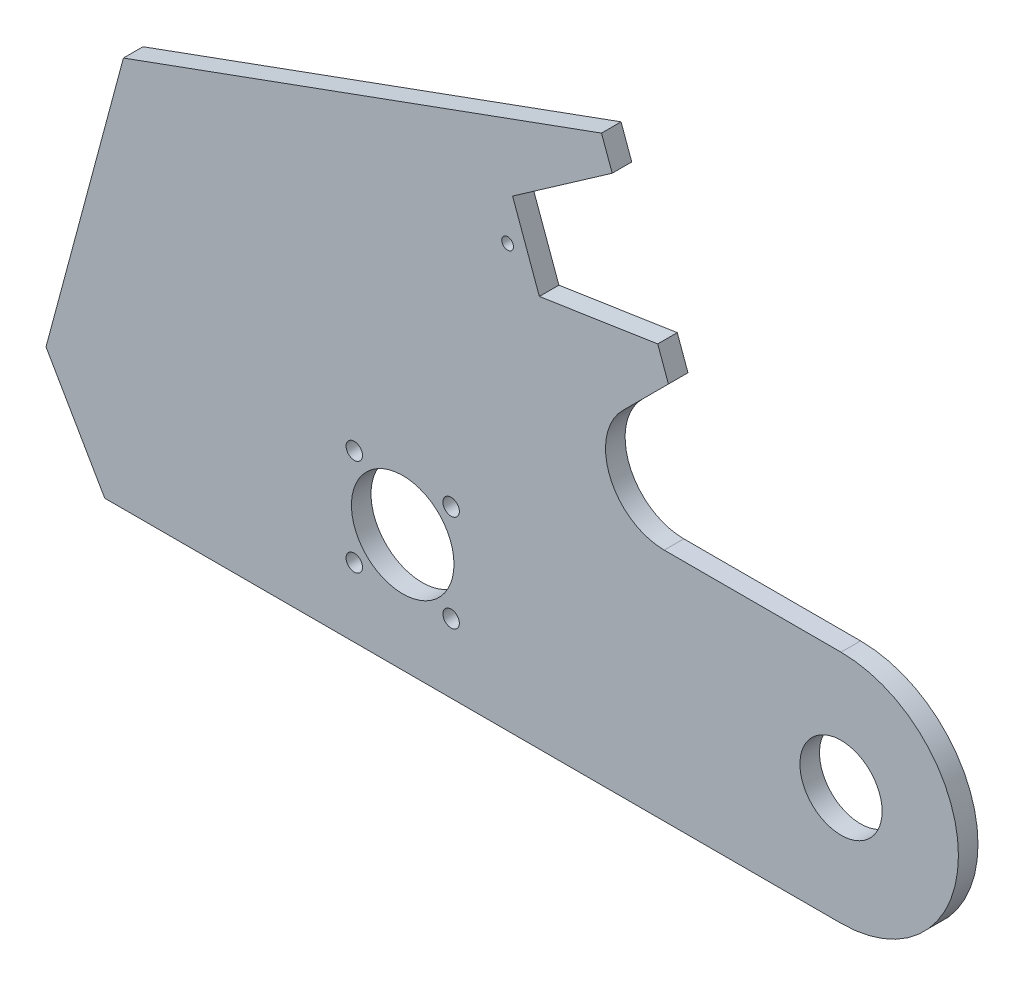
ISO-10303-21;
HEADER;
FILE_DESCRIPTION(('STEP AP214'),'2;1');
FILE_NAME('part.step','',(''),(''),'','','');
FILE_SCHEMA(('AUTOMOTIVE_DESIGN { 1 0 10303 214 1 1 1 1 }'));
ENDSEC;
DATA;
#1=APPLICATION_CONTEXT('core data for automotive mechanical design processes');
#2=APPLICATION_PROTOCOL_DEFINITION('international standard','automotive_design',2000,#1);
#3=PRODUCT_CONTEXT('',#1,'mechanical');
#4=PRODUCT('Part','Part','',(#3));
#5=PRODUCT_RELATED_PRODUCT_CATEGORY('part','',(#4));
#6=PRODUCT_DEFINITION_FORMATION('','',#4);
#7=PRODUCT_DEFINITION_CONTEXT('part definition',#1,'design');
#8=PRODUCT_DEFINITION('design','',#6,#7);
#9=PRODUCT_DEFINITION_SHAPE('','',#8);
#10=(LENGTH_UNIT() NAMED_UNIT(*) SI_UNIT(.MILLI.,.METRE.));
#11=(NAMED_UNIT(*) PLANE_ANGLE_UNIT() SI_UNIT($,.RADIAN.));
#12=(NAMED_UNIT(*) SI_UNIT($,.STERADIAN.) SOLID_ANGLE_UNIT());
#13=UNCERTAINTY_MEASURE_WITH_UNIT(LENGTH_MEASURE(1.E-05),#10,'distance_accuracy_value','');
#14=(GEOMETRIC_REPRESENTATION_CONTEXT(3) GLOBAL_UNCERTAINTY_ASSIGNED_CONTEXT((#13)) GLOBAL_UNIT_ASSIGNED_CONTEXT((#10,
#11,#12)) REPRESENTATION_CONTEXT('',''));
#15=CARTESIAN_POINT('',(0.,0.,0.));
#16=DIRECTION('',(0.,0.,1.));
#17=DIRECTION('',(1.,0.,0.));
#18=AXIS2_PLACEMENT_3D('',#15,#16,#17);
#19=CARTESIAN_POINT('',(74.89234488638,161.13121478231,-6.43945454671325));
#20=DIRECTION('',(-0.93969262078591,-0.342020143325664,0.));
#21=DIRECTION('',(0.342020143325664,-0.93969262078591,0.));
#22=AXIS2_PLACEMENT_3D('',#19,#20,#21);
#23=PLANE('',#22);
#24=DIRECTION('',(-0.342020143325664,0.93969262078591,0.));
#25=VECTOR('',#24,1.);
#26=CARTESIAN_POINT('',(74.89234488638,161.13121478231,-11.4394545467132));
#27=LINE('',#26,#25);
#28=CARTESIAN_POINT('',(91.9933520526632,114.146583743014,-11.4394545467132));
#29=VERTEX_POINT('',#28);
#30=CARTESIAN_POINT('',(89.2571909060579,121.664124709302,-11.4394545467132));
#31=VERTEX_POINT('',#30);
#32=EDGE_CURVE('E202',#29,#31,#27,.T.);
#33=ORIENTED_EDGE('',*,*,#32,.T.);
#34=DIRECTION('',(0.,0.,1.));
#35=VECTOR('',#34,1.);
#36=CARTESIAN_POINT('',(89.2571909060579,121.664124709302,-11.4394545467132));
#37=LINE('',#36,#35);
#38=CARTESIAN_POINT('',(89.2571909060579,121.664124709302,-6.43945454671325));
#39=VERTEX_POINT('',#38);
#40=EDGE_CURVE('E163',#31,#39,#37,.T.);
#41=ORIENTED_EDGE('',*,*,#40,.T.);
#42=DIRECTION('',(-0.342020143325664,0.93969262078591,0.));
#43=VECTOR('',#42,1.);
#44=CARTESIAN_POINT('',(74.89234488638,161.13121478231,-6.43945454671325));
#45=LINE('',#44,#43);
#46=CARTESIAN_POINT('',(91.9933520526632,114.146583743014,-6.43945454671325));
#47=VERTEX_POINT('',#46);
#48=EDGE_CURVE('E184',#47,#39,#45,.T.);
#49=ORIENTED_EDGE('',*,*,#48,.F.);
#50=DIRECTION('',(0.,0.,-1.));
#51=VECTOR('',#50,1.);
#52=CARTESIAN_POINT('',(91.9933520526632,114.146583743014,-6.43945454671325));
#53=LINE('',#52,#51);
#54=EDGE_CURVE('E226',#47,#29,#53,.T.);
#55=ORIENTED_EDGE('',*,*,#54,.T.);
#56=EDGE_LOOP('',(#33,#41,#49,#55));
#57=FACE_BOUND('',#56,.T.);
#58=ADVANCED_FACE('F34',(#57),#23,.F.);
#59=CARTESIAN_POINT('',(136.098229907914,46.8676693314216,-6.43945454671325));
#60=DIRECTION('',(0.,0.,1.));
#61=DIRECTION('',(1.,0.,0.));
#62=AXIS2_PLACEMENT_3D('',#59,#60,#61);
#63=PLANE('',#62);
#64=CARTESIAN_POINT('',(11.7238612371492,34.493300660657,-6.43945454671325));
#65=DIRECTION('',(0.,0.,1.));
#66=DIRECTION('',(1.,0.,0.));
#67=AXIS2_PLACEMENT_3D('',#64,#65,#66);
#68=CIRCLE('',#67,2.1);
#69=CARTESIAN_POINT('',(13.8238612371492,34.493300660657,-6.43945454671325));
#70=VERTEX_POINT('',#69);
#71=EDGE_CURVE('E443',#70,#70,#68,.T.);
#72=ORIENTED_EDGE('',*,*,#71,.F.);
#73=EDGE_LOOP('',(#72));
#74=FACE_BOUND('',#73,.T.);
#75=CARTESIAN_POINT('',(36.4725985786784,34.493300660657,-6.43945454671325));
#76=DIRECTION('',(0.,0.,1.));
#77=DIRECTION('',(1.,0.,0.));
#78=AXIS2_PLACEMENT_3D('',#75,#76,#77);
#79=CIRCLE('',#78,2.1);
#80=CARTESIAN_POINT('',(38.5725985786784,34.493300660657,-6.43945454671325));
#81=VERTEX_POINT('',#80);
#82=EDGE_CURVE('E445',#81,#81,#79,.T.);
#83=ORIENTED_EDGE('',*,*,#82,.F.);
#84=EDGE_LOOP('',(#83));
#85=FACE_BOUND('',#84,.T.);
#86=CARTESIAN_POINT('',(36.4725985786784,59.2420380021862,-6.43945454671325));
#87=DIRECTION('',(0.,0.,1.));
#88=DIRECTION('',(1.,0.,0.));
#89=AXIS2_PLACEMENT_3D('',#86,#87,#88);
#90=CIRCLE('',#89,2.1);
#91=CARTESIAN_POINT('',(38.5725985786784,59.2420380021862,-6.43945454671325));
#92=VERTEX_POINT('',#91);
#93=EDGE_CURVE('E475',#92,#92,#90,.T.);
#94=ORIENTED_EDGE('',*,*,#93,.F.);
#95=EDGE_LOOP('',(#94));
#96=FACE_BOUND('',#95,.T.);
#97=CARTESIAN_POINT('',(11.7238612371492,59.2420380021862,-6.43945454671325));
#98=DIRECTION('',(0.,0.,1.));
#99=DIRECTION('',(1.,0.,0.));
#100=AXIS2_PLACEMENT_3D('',#97,#98,#99);
#101=CIRCLE('',#100,2.1);
#102=CARTESIAN_POINT('',(13.8238612371492,59.2420380021862,-6.43945454671325));
#103=VERTEX_POINT('',#102);
#104=EDGE_CURVE('E465',#103,#103,#101,.T.);
#105=ORIENTED_EDGE('',*,*,#104,.F.);
#106=EDGE_LOOP('',(#105));
#107=FACE_BOUND('',#106,.T.);
#108=CARTESIAN_POINT('',(24.0982299079138,46.8676693314216,-6.43945454671325));
#109=DIRECTION('',(0.,0.,1.));
#110=DIRECTION('',(1.,0.,0.));
#111=AXIS2_PLACEMENT_3D('',#108,#109,#110);
#112=CIRCLE('',#111,13.1);
#113=CARTESIAN_POINT('',(37.1982299079138,46.8676693314216,-6.43945454671325));
#114=VERTEX_POINT('',#113);
#115=EDGE_CURVE('E452',#114,#114,#112,.T.);
#116=ORIENTED_EDGE('',*,*,#115,.F.);
#117=EDGE_LOOP('',(#116));
#118=FACE_BOUND('',#117,.T.);
#119=CARTESIAN_POINT('',(50.8956268853404,124.728501625478,-6.43945454671325));
#120=DIRECTION('',(0.,0.,1.));
#121=DIRECTION('',(1.,0.,0.));
#122=AXIS2_PLACEMENT_3D('',#119,#120,#121);
#123=CIRCLE('',#122,1.5);
#124=CARTESIAN_POINT('',(52.3956268853404,124.728501625478,-6.43945454671325));
#125=VERTEX_POINT('',#124);
#126=EDGE_CURVE('E156',#125,#125,#123,.T.);
#127=ORIENTED_EDGE('',*,*,#126,.F.);
#128=EDGE_LOOP('',(#127));
#129=FACE_BOUND('',#128,.T.);
#130=DIRECTION('',(0.988520093680456,0.151089458235781,0.));
#131=VECTOR('',#130,1.);
#132=CARTESIAN_POINT('',(59.0142914225266,117.041676134247,-6.43945454671325));
#133=LINE('',#132,#131);
#134=CARTESIAN_POINT('',(59.0142914225266,117.041676134247,-6.43945454671325));
#135=VERTEX_POINT('',#134);
#136=EDGE_CURVE('E151',#135,#39,#133,.T.);
#137=ORIENTED_EDGE('',*,*,#136,.F.);
#138=DIRECTION('',(0.342020143325664,-0.93969262078591,0.));
#139=VECTOR('',#138,1.);
#140=CARTESIAN_POINT('',(52.1738885560133,135.835528549965,-6.43945454671325));
#141=LINE('',#140,#139);
#142=CARTESIAN_POINT('',(52.1738885560133,135.835528549965,-6.43945454671325));
#143=VERTEX_POINT('',#142);
#144=EDGE_CURVE('E153',#143,#135,#141,.T.);
#145=ORIENTED_EDGE('',*,*,#144,.F.);
#146=DIRECTION('',(-0.819838026014496,-0.572595503912365,0.));
#147=VECTOR('',#146,1.);
#148=CARTESIAN_POINT('',(77.6285060329854,153.613673816023,-6.43945454671325));
#149=LINE('',#148,#147);
#150=CARTESIAN_POINT('',(77.6285060329854,153.613673816023,-6.43945454671325));
#151=VERTEX_POINT('',#150);
#152=EDGE_CURVE('E131',#151,#143,#149,.T.);
#153=ORIENTED_EDGE('',*,*,#152,.F.);
#154=CARTESIAN_POINT('',(74.89234488638,161.13121478231,-6.43945454671325));
#155=VERTEX_POINT('',#154);
#156=EDGE_CURVE('E183',#151,#155,#45,.T.);
#157=ORIENTED_EDGE('',*,*,#156,.T.);
#158=DIRECTION('',(-0.93969262078591,-0.342020143325664,0.));
#159=VECTOR('',#158,1.);
#160=CARTESIAN_POINT('',(-47.2676958157883,116.668596149974,-6.43945454671325));
#161=LINE('',#160,#159);
#162=CARTESIAN_POINT('',(-47.2676958157883,116.668596149974,-6.43945454671325));
#163=VERTEX_POINT('',#162);
#164=EDGE_CURVE('E187',#155,#163,#161,.T.);
#165=ORIENTED_EDGE('',*,*,#164,.T.);
#166=DIRECTION('',(-0.258819045102524,-0.965925826289067,0.));
#167=VECTOR('',#166,1.);
#168=CARTESIAN_POINT('',(-67.0477493336309,42.8484314449548,-6.43945454671325));
#169=LINE('',#168,#167);
#170=CARTESIAN_POINT('',(-67.0477493336309,42.8484314449548,-6.43945454671325));
#171=VERTEX_POINT('',#170);
#172=EDGE_CURVE('E189',#163,#171,#169,.T.);
#173=ORIENTED_EDGE('',*,*,#172,.T.);
#174=DIRECTION('',(0.499999999999998,-0.86602540378444,0.));
#175=VECTOR('',#174,1.);
#176=CARTESIAN_POINT('',(-52.0477493336309,16.8676693314216,-6.43945454671325));
#177=LINE('',#176,#175);
#178=CARTESIAN_POINT('',(-52.0477493336309,16.8676693314216,-6.43945454671325));
#179=VERTEX_POINT('',#178);
#180=EDGE_CURVE('E191',#171,#179,#177,.T.);
#181=ORIENTED_EDGE('',*,*,#180,.T.);
#182=DIRECTION('',(1.,0.,0.));
#183=VECTOR('',#182,1.);
#184=CARTESIAN_POINT('',(136.098229907914,16.8676693314216,-6.43945454671325));
#185=LINE('',#184,#183);
#186=CARTESIAN_POINT('',(136.098229907914,16.8676693314216,-6.43945454671325));
#187=VERTEX_POINT('',#186);
#188=EDGE_CURVE('E193',#179,#187,#185,.T.);
#189=ORIENTED_EDGE('',*,*,#188,.T.);
#190=CARTESIAN_POINT('',(136.098229907914,46.8676693314216,-6.43945454671325));
#191=DIRECTION('',(0.,0.,1.));
#192=DIRECTION('',(1.,0.,0.));
#193=AXIS2_PLACEMENT_3D('',#190,#191,#192);
#194=CIRCLE('',#193,30.);
#195=CARTESIAN_POINT('',(136.098229907914,76.8676693314216,-6.43945454671325));
#196=VERTEX_POINT('',#195);
#197=EDGE_CURVE('E175',#187,#196,#194,.T.);
#198=ORIENTED_EDGE('',*,*,#197,.T.);
#199=DIRECTION('',(-1.,0.,0.));
#200=VECTOR('',#199,1.);
#201=CARTESIAN_POINT('',(136.098229907914,76.8676693314216,-6.43945454671325));
#202=LINE('',#201,#200);
#203=CARTESIAN_POINT('',(90.9276410766668,76.8676693314216,-6.43945454671325));
#204=VERTEX_POINT('',#203);
#205=EDGE_CURVE('E178',#196,#204,#202,.T.);
#206=ORIENTED_EDGE('',*,*,#205,.T.);
#207=CARTESIAN_POINT('',(90.9276410766668,91.8676693314216,-6.43945454671325));
#208=DIRECTION('',(0.,0.,1.));
#209=DIRECTION('',(1.,0.,0.));
#210=AXIS2_PLACEMENT_3D('',#207,#208,#209);
#211=CIRCLE('',#210,15.);
#212=CARTESIAN_POINT('',(80.3210393588686,102.47427104922,-6.43945454671325));
#213=VERTEX_POINT('',#212);
#214=EDGE_CURVE('E11',#204,#213,#211,.F.);
#215=ORIENTED_EDGE('',*,*,#214,.T.);
#216=DIRECTION('',(0.707106781186546,0.707106781186549,0.));
#217=VECTOR('',#216,1.);
#218=CARTESIAN_POINT('',(91.9933520526632,114.146583743014,-6.43945454671325));
#219=LINE('',#218,#217);
#220=EDGE_CURVE('E181',#213,#47,#219,.T.);
#221=ORIENTED_EDGE('',*,*,#220,.T.);
#222=ORIENTED_EDGE('',*,*,#48,.T.);
#223=EDGE_LOOP('',(#137,#145,#153,#157,#165,#173,#181,#189,#198,#206,#215,#221,#222));
#224=FACE_BOUND('',#223,.T.);
#225=CARTESIAN_POINT('',(136.098229907914,46.8676693314216,-6.43945454671325));
#226=DIRECTION('',(0.,0.,1.));
#227=DIRECTION('',(1.,0.,0.));
#228=AXIS2_PLACEMENT_3D('',#225,#226,#227);
#229=CIRCLE('',#228,10.5);
#230=CARTESIAN_POINT('',(146.598229907914,46.8676693314216,-6.43945454671325));
#231=VERTEX_POINT('',#230);
#232=EDGE_CURVE('E169',#231,#231,#229,.T.);
#233=ORIENTED_EDGE('',*,*,#232,.F.);
#234=EDGE_LOOP('',(#233));
#235=FACE_BOUND('',#234,.T.);
#236=ADVANCED_FACE('F246',(#74,#85,#96,#107,#118,#129,#224,#235),#63,.T.);
#237=CARTESIAN_POINT('',(136.098229907914,46.8676693314216,-11.4394545467132));
#238=DIRECTION('',(0.,0.,1.));
#239=DIRECTION('',(1.,0.,0.));
#240=AXIS2_PLACEMENT_3D('',#237,#238,#239);
#241=PLANE('',#240);
#242=CARTESIAN_POINT('',(11.7238612371492,34.493300660657,-11.4394545467132));
#243=DIRECTION('',(0.,0.,1.));
#244=DIRECTION('',(1.,0.,0.));
#245=AXIS2_PLACEMENT_3D('',#242,#243,#244);
#246=CIRCLE('',#245,2.1);
#247=CARTESIAN_POINT('',(13.8238612371492,34.493300660657,-11.4394545467132));
#248=VERTEX_POINT('',#247);
#249=EDGE_CURVE('E440',#248,#248,#246,.T.);
#250=ORIENTED_EDGE('',*,*,#249,.T.);
#251=EDGE_LOOP('',(#250));
#252=FACE_BOUND('',#251,.T.);
#253=CARTESIAN_POINT('',(36.4725985786784,34.493300660657,-11.4394545467132));
#254=DIRECTION('',(0.,0.,1.));
#255=DIRECTION('',(1.,0.,0.));
#256=AXIS2_PLACEMENT_3D('',#253,#254,#255);
#257=CIRCLE('',#256,2.1);
#258=CARTESIAN_POINT('',(38.5725985786784,34.493300660657,-11.4394545467132));
#259=VERTEX_POINT('',#258);
#260=EDGE_CURVE('E478',#259,#259,#257,.T.);
#261=ORIENTED_EDGE('',*,*,#260,.T.);
#262=EDGE_LOOP('',(#261));
#263=FACE_BOUND('',#262,.T.);
#264=CARTESIAN_POINT('',(36.4725985786784,59.2420380021862,-11.4394545467132));
#265=DIRECTION('',(0.,0.,1.));
#266=DIRECTION('',(1.,0.,0.));
#267=AXIS2_PLACEMENT_3D('',#264,#265,#266);
#268=CIRCLE('',#267,2.1);
#269=CARTESIAN_POINT('',(38.5725985786784,59.2420380021862,-11.4394545467132));
#270=VERTEX_POINT('',#269);
#271=EDGE_CURVE('E470',#270,#270,#268,.T.);
#272=ORIENTED_EDGE('',*,*,#271,.T.);
#273=EDGE_LOOP('',(#272));
#274=FACE_BOUND('',#273,.T.);
#275=CARTESIAN_POINT('',(11.7238612371492,59.2420380021862,-11.4394545467132));
#276=DIRECTION('',(0.,0.,1.));
#277=DIRECTION('',(1.,0.,0.));
#278=AXIS2_PLACEMENT_3D('',#275,#276,#277);
#279=CIRCLE('',#278,2.1);
#280=CARTESIAN_POINT('',(13.8238612371492,59.2420380021862,-11.4394545467132));
#281=VERTEX_POINT('',#280);
#282=EDGE_CURVE('E454',#281,#281,#279,.T.);
#283=ORIENTED_EDGE('',*,*,#282,.T.);
#284=EDGE_LOOP('',(#283));
#285=FACE_BOUND('',#284,.T.);
#286=CARTESIAN_POINT('',(24.0982299079138,46.8676693314216,-11.4394545467132));
#287=DIRECTION('',(0.,0.,1.));
#288=DIRECTION('',(1.,0.,0.));
#289=AXIS2_PLACEMENT_3D('',#286,#287,#288);
#290=CIRCLE('',#289,13.1);
#291=CARTESIAN_POINT('',(37.1982299079138,46.8676693314216,-11.4394545467132));
#292=VERTEX_POINT('',#291);
#293=EDGE_CURVE('E449',#292,#292,#290,.T.);
#294=ORIENTED_EDGE('',*,*,#293,.T.);
#295=EDGE_LOOP('',(#294));
#296=FACE_BOUND('',#295,.T.);
#297=CARTESIAN_POINT('',(50.8956268853404,124.728501625478,-11.4394545467132));
#298=DIRECTION('',(0.,0.,1.));
#299=DIRECTION('',(1.,0.,0.));
#300=AXIS2_PLACEMENT_3D('',#297,#298,#299);
#301=CIRCLE('',#300,1.5);
#302=CARTESIAN_POINT('',(52.3956268853404,124.728501625478,-11.4394545467132));
#303=VERTEX_POINT('',#302);
#304=EDGE_CURVE('E161',#303,#303,#301,.T.);
#305=ORIENTED_EDGE('',*,*,#304,.T.);
#306=EDGE_LOOP('',(#305));
#307=FACE_BOUND('',#306,.T.);
#308=DIRECTION('',(0.342020143325664,-0.93969262078591,0.));
#309=VECTOR('',#308,1.);
#310=CARTESIAN_POINT('',(52.1738885560133,135.835528549965,-11.4394545467132));
#311=LINE('',#310,#309);
#312=CARTESIAN_POINT('',(52.1738885560133,135.835528549965,-11.4394545467132));
#313=VERTEX_POINT('',#312);
#314=CARTESIAN_POINT('',(59.0142914225266,117.041676134247,-11.4394545467132));
#315=VERTEX_POINT('',#314);
#316=EDGE_CURVE('E139',#313,#315,#311,.T.);
#317=ORIENTED_EDGE('',*,*,#316,.T.);
#318=DIRECTION('',(0.988520093680456,0.151089458235781,0.));
#319=VECTOR('',#318,1.);
#320=CARTESIAN_POINT('',(59.0142914225266,117.041676134247,-11.4394545467132));
#321=LINE('',#320,#319);
#322=EDGE_CURVE('E144',#315,#31,#321,.T.);
#323=ORIENTED_EDGE('',*,*,#322,.T.);
#324=ORIENTED_EDGE('',*,*,#32,.F.);
#325=DIRECTION('',(0.707106781186546,0.707106781186549,0.));
#326=VECTOR('',#325,1.);
#327=CARTESIAN_POINT('',(91.9933520526632,114.146583743014,-11.4394545467132));
#328=LINE('',#327,#326);
#329=CARTESIAN_POINT('',(80.3210393588686,102.47427104922,-11.4394545467132));
#330=VERTEX_POINT('',#329);
#331=EDGE_CURVE('E200',#330,#29,#328,.T.);
#332=ORIENTED_EDGE('',*,*,#331,.F.);
#333=CARTESIAN_POINT('',(90.9276410766668,91.8676693314216,-11.4394545467132));
#334=DIRECTION('',(0.,0.,1.));
#335=DIRECTION('',(1.,0.,0.));
#336=AXIS2_PLACEMENT_3D('',#333,#334,#335);
#337=CIRCLE('',#336,15.);
#338=CARTESIAN_POINT('',(90.9276410766668,76.8676693314216,-11.4394545467132));
#339=VERTEX_POINT('',#338);
#340=EDGE_CURVE('E42',#330,#339,#337,.T.);
#341=ORIENTED_EDGE('',*,*,#340,.T.);
#342=DIRECTION('',(-1.,0.,0.));
#343=VECTOR('',#342,1.);
#344=CARTESIAN_POINT('',(136.098229907914,76.8676693314216,-11.4394545467132));
#345=LINE('',#344,#343);
#346=CARTESIAN_POINT('',(136.098229907914,76.8676693314216,-11.4394545467132));
#347=VERTEX_POINT('',#346);
#348=EDGE_CURVE('E198',#347,#339,#345,.T.);
#349=ORIENTED_EDGE('',*,*,#348,.F.);
#350=CARTESIAN_POINT('',(136.098229907914,46.8676693314216,-11.4394545467132));
#351=DIRECTION('',(0.,0.,1.));
#352=DIRECTION('',(1.,0.,0.));
#353=AXIS2_PLACEMENT_3D('',#350,#351,#352);
#354=CIRCLE('',#353,30.);
#355=CARTESIAN_POINT('',(136.098229907914,16.8676693314216,-11.4394545467132));
#356=VERTEX_POINT('',#355);
#357=EDGE_CURVE('E172',#356,#347,#354,.T.);
#358=ORIENTED_EDGE('',*,*,#357,.F.);
#359=DIRECTION('',(1.,0.,0.));
#360=VECTOR('',#359,1.);
#361=CARTESIAN_POINT('',(136.098229907914,16.8676693314216,-11.4394545467132));
#362=LINE('',#361,#360);
#363=CARTESIAN_POINT('',(-52.0477493336309,16.8676693314216,-11.4394545467132));
#364=VERTEX_POINT('',#363);
#365=EDGE_CURVE('E179',#364,#356,#362,.T.);
#366=ORIENTED_EDGE('',*,*,#365,.F.);
#367=DIRECTION('',(0.499999999999998,-0.86602540378444,0.));
#368=VECTOR('',#367,1.);
#369=CARTESIAN_POINT('',(-52.0477493336309,16.8676693314216,-11.4394545467132));
#370=LINE('',#369,#368);
#371=CARTESIAN_POINT('',(-67.0477493336309,42.8484314449548,-11.4394545467132));
#372=VERTEX_POINT('',#371);
#373=EDGE_CURVE('E209',#372,#364,#370,.T.);
#374=ORIENTED_EDGE('',*,*,#373,.F.);
#375=DIRECTION('',(-0.258819045102524,-0.965925826289067,0.));
#376=VECTOR('',#375,1.);
#377=CARTESIAN_POINT('',(-67.0477493336309,42.8484314449548,-11.4394545467132));
#378=LINE('',#377,#376);
#379=CARTESIAN_POINT('',(-47.2676958157883,116.668596149974,-11.4394545467132));
#380=VERTEX_POINT('',#379);
#381=EDGE_CURVE('E207',#380,#372,#378,.T.);
#382=ORIENTED_EDGE('',*,*,#381,.F.);
#383=DIRECTION('',(-0.93969262078591,-0.342020143325664,0.));
#384=VECTOR('',#383,1.);
#385=CARTESIAN_POINT('',(-47.2676958157883,116.668596149974,-11.4394545467132));
#386=LINE('',#385,#384);
#387=CARTESIAN_POINT('',(74.89234488638,161.13121478231,-11.4394545467132));
#388=VERTEX_POINT('',#387);
#389=EDGE_CURVE('E205',#388,#380,#386,.T.);
#390=ORIENTED_EDGE('',*,*,#389,.F.);
#391=CARTESIAN_POINT('',(77.6285060329854,153.613673816023,-11.4394545467132));
#392=VERTEX_POINT('',#391);
#393=EDGE_CURVE('E150',#392,#388,#27,.T.);
#394=ORIENTED_EDGE('',*,*,#393,.F.);
#395=DIRECTION('',(-0.819838026014496,-0.572595503912365,0.));
#396=VECTOR('',#395,1.);
#397=CARTESIAN_POINT('',(77.6285060329854,153.613673816023,-11.4394545467132));
#398=LINE('',#397,#396);
#399=EDGE_CURVE('E49',#392,#313,#398,.T.);
#400=ORIENTED_EDGE('',*,*,#399,.T.);
#401=EDGE_LOOP('',(#317,#323,#324,#332,#341,#349,#358,#366,#374,#382,#390,#394,#400));
#402=FACE_BOUND('',#401,.T.);
#403=CARTESIAN_POINT('',(136.098229907914,46.8676693314216,-11.4394545467132));
#404=DIRECTION('',(0.,0.,1.));
#405=DIRECTION('',(1.,0.,0.));
#406=AXIS2_PLACEMENT_3D('',#403,#404,#405);
#407=CIRCLE('',#406,10.5);
#408=CARTESIAN_POINT('',(146.598229907914,46.8676693314216,-11.4394545467132));
#409=VERTEX_POINT('',#408);
#410=EDGE_CURVE('E166',#409,#409,#407,.T.);
#411=ORIENTED_EDGE('',*,*,#410,.T.);
#412=EDGE_LOOP('',(#411));
#413=FACE_BOUND('',#412,.T.);
#414=ADVANCED_FACE('F147',(#252,#263,#274,#285,#296,#307,#402,#413),#241,.F.);
#415=CARTESIAN_POINT('',(136.098229907914,46.8676693314216,-6.43945454671325));
#416=DIRECTION('',(0.,0.,-1.));
#417=DIRECTION('',(-1.,0.,0.));
#418=AXIS2_PLACEMENT_3D('',#415,#416,#417);
#419=CYLINDRICAL_SURFACE('',#418,30.);
#420=ORIENTED_EDGE('',*,*,#357,.T.);
#421=DIRECTION('',(0.,0.,-1.));
#422=VECTOR('',#421,1.);
#423=CARTESIAN_POINT('',(136.098229907914,76.8676693314216,-6.43945454671325));
#424=LINE('',#423,#422);
#425=EDGE_CURVE('E229',#196,#347,#424,.T.);
#426=ORIENTED_EDGE('',*,*,#425,.F.);
#427=ORIENTED_EDGE('',*,*,#197,.F.);
#428=DIRECTION('',(0.,0.,-1.));
#429=VECTOR('',#428,1.);
#430=CARTESIAN_POINT('',(136.098229907914,16.8676693314216,-6.43945454671325));
#431=LINE('',#430,#429);
#432=EDGE_CURVE('E195',#187,#356,#431,.T.);
#433=ORIENTED_EDGE('',*,*,#432,.T.);
#434=EDGE_LOOP('',(#420,#426,#427,#433));
#435=FACE_BOUND('',#434,.T.);
#436=ADVANCED_FACE('F303',(#435),#419,.T.);
#437=CARTESIAN_POINT('',(136.098229907914,76.8676693314216,-6.43945454671325));
#438=DIRECTION('',(0.,-1.,0.));
#439=DIRECTION('',(1.,0.,0.));
#440=AXIS2_PLACEMENT_3D('',#437,#438,#439);
#441=PLANE('',#440);
#442=ORIENTED_EDGE('',*,*,#348,.T.);
#443=DIRECTION('',(0.,0.,-1.));
#444=VECTOR('',#443,1.);
#445=CARTESIAN_POINT('',(90.9276410766668,76.8676693314216,-6.43945454671325));
#446=LINE('',#445,#444);
#447=EDGE_CURVE('E57',#339,#204,#446,.F.);
#448=ORIENTED_EDGE('',*,*,#447,.T.);
#449=ORIENTED_EDGE('',*,*,#205,.F.);
#450=ORIENTED_EDGE('',*,*,#425,.T.);
#451=EDGE_LOOP('',(#442,#448,#449,#450));
#452=FACE_BOUND('',#451,.T.);
#453=ADVANCED_FACE('F240',(#452),#441,.F.);
#454=CARTESIAN_POINT('',(91.9933520526632,114.146583743014,-6.43945454671325));
#455=DIRECTION('',(-0.707106781186549,0.707106781186546,0.));
#456=DIRECTION('',(-0.707106781186546,-0.707106781186549,0.));
#457=AXIS2_PLACEMENT_3D('',#454,#455,#456);
#458=PLANE('',#457);
#459=ORIENTED_EDGE('',*,*,#220,.F.);
#460=DIRECTION('',(0.,0.,-1.));
#461=VECTOR('',#460,1.);
#462=CARTESIAN_POINT('',(80.3210393588686,102.47427104922,-11.4394545467132));
#463=LINE('',#462,#461);
#464=EDGE_CURVE('E232',#213,#330,#463,.T.);
#465=ORIENTED_EDGE('',*,*,#464,.T.);
#466=ORIENTED_EDGE('',*,*,#331,.T.);
#467=ORIENTED_EDGE('',*,*,#54,.F.);
#468=EDGE_LOOP('',(#459,#465,#466,#467));
#469=FACE_BOUND('',#468,.T.);
#470=ADVANCED_FACE('F250',(#469),#458,.F.);
#471=ORIENTED_EDGE('',*,*,#156,.F.);
#472=DIRECTION('',(0.,0.,1.));
#473=VECTOR('',#472,1.);
#474=CARTESIAN_POINT('',(77.6285060329854,153.613673816023,-11.4394545467132));
#475=LINE('',#474,#473);
#476=EDGE_CURVE('E136',#392,#151,#475,.T.);
#477=ORIENTED_EDGE('',*,*,#476,.F.);
#478=ORIENTED_EDGE('',*,*,#393,.T.);
#479=DIRECTION('',(0.,0.,-1.));
#480=VECTOR('',#479,1.);
#481=CARTESIAN_POINT('',(74.89234488638,161.13121478231,-6.43945454671325));
#482=LINE('',#481,#480);
#483=EDGE_CURVE('E223',#155,#388,#482,.T.);
#484=ORIENTED_EDGE('',*,*,#483,.F.);
#485=EDGE_LOOP('',(#471,#477,#478,#484));
#486=FACE_BOUND('',#485,.T.);
#487=ADVANCED_FACE('F266',(#486),#23,.F.);
#488=CARTESIAN_POINT('',(-47.2676958157883,116.668596149974,-6.43945454671325));
#489=DIRECTION('',(0.342020143325664,-0.93969262078591,0.));
#490=DIRECTION('',(0.93969262078591,0.342020143325664,0.));
#491=AXIS2_PLACEMENT_3D('',#488,#489,#490);
#492=PLANE('',#491);
#493=ORIENTED_EDGE('',*,*,#389,.T.);
#494=DIRECTION('',(0.,0.,-1.));
#495=VECTOR('',#494,1.);
#496=CARTESIAN_POINT('',(-47.2676958157883,116.668596149974,-6.43945454671325));
#497=LINE('',#496,#495);
#498=EDGE_CURVE('E220',#163,#380,#497,.T.);
#499=ORIENTED_EDGE('',*,*,#498,.F.);
#500=ORIENTED_EDGE('',*,*,#164,.F.);
#501=ORIENTED_EDGE('',*,*,#483,.T.);
#502=EDGE_LOOP('',(#493,#499,#500,#501));
#503=FACE_BOUND('',#502,.T.);
#504=ADVANCED_FACE('F275',(#503),#492,.F.);
#505=CARTESIAN_POINT('',(-67.0477493336309,42.8484314449548,-6.43945454671325));
#506=DIRECTION('',(0.965925826289067,-0.258819045102524,0.));
#507=DIRECTION('',(0.258819045102524,0.965925826289068,0.));
#508=AXIS2_PLACEMENT_3D('',#505,#506,#507);
#509=PLANE('',#508);
#510=ORIENTED_EDGE('',*,*,#381,.T.);
#511=DIRECTION('',(0.,0.,-1.));
#512=VECTOR('',#511,1.);
#513=CARTESIAN_POINT('',(-67.0477493336309,42.8484314449548,-6.43945454671325));
#514=LINE('',#513,#512);
#515=EDGE_CURVE('E217',#171,#372,#514,.T.);
#516=ORIENTED_EDGE('',*,*,#515,.F.);
#517=ORIENTED_EDGE('',*,*,#172,.F.);
#518=ORIENTED_EDGE('',*,*,#498,.T.);
#519=EDGE_LOOP('',(#510,#516,#517,#518));
#520=FACE_BOUND('',#519,.T.);
#521=ADVANCED_FACE('F281',(#520),#509,.F.);
#522=CARTESIAN_POINT('',(-52.0477493336309,16.8676693314216,-6.43945454671325));
#523=DIRECTION('',(0.86602540378444,0.499999999999998,0.));
#524=DIRECTION('',(-0.499999999999998,0.86602540378444,0.));
#525=AXIS2_PLACEMENT_3D('',#522,#523,#524);
#526=PLANE('',#525);
#527=ORIENTED_EDGE('',*,*,#373,.T.);
#528=DIRECTION('',(0.,0.,-1.));
#529=VECTOR('',#528,1.);
#530=CARTESIAN_POINT('',(-52.0477493336309,16.8676693314216,-6.43945454671325));
#531=LINE('',#530,#529);
#532=EDGE_CURVE('E214',#179,#364,#531,.T.);
#533=ORIENTED_EDGE('',*,*,#532,.F.);
#534=ORIENTED_EDGE('',*,*,#180,.F.);
#535=ORIENTED_EDGE('',*,*,#515,.T.);
#536=EDGE_LOOP('',(#527,#533,#534,#535));
#537=FACE_BOUND('',#536,.T.);
#538=ADVANCED_FACE('F295',(#537),#526,.F.);
#539=CARTESIAN_POINT('',(136.098229907914,16.8676693314216,-6.43945454671325));
#540=DIRECTION('',(0.,1.,0.));
#541=DIRECTION('',(-1.,0.,0.));
#542=AXIS2_PLACEMENT_3D('',#539,#540,#541);
#543=PLANE('',#542);
#544=ORIENTED_EDGE('',*,*,#365,.T.);
#545=ORIENTED_EDGE('',*,*,#432,.F.);
#546=ORIENTED_EDGE('',*,*,#188,.F.);
#547=ORIENTED_EDGE('',*,*,#532,.T.);
#548=EDGE_LOOP('',(#544,#545,#546,#547));
#549=FACE_BOUND('',#548,.T.);
#550=ADVANCED_FACE('F300',(#549),#543,.F.);
#551=CARTESIAN_POINT('',(136.098229907914,46.8676693314216,-6.43945454671325));
#552=DIRECTION('',(0.,0.,-1.));
#553=DIRECTION('',(-1.,0.,0.));
#554=AXIS2_PLACEMENT_3D('',#551,#552,#553);
#555=CYLINDRICAL_SURFACE('',#554,10.5);
#556=ORIENTED_EDGE('',*,*,#232,.T.);
#557=EDGE_LOOP('',(#556));
#558=FACE_BOUND('',#557,.T.);
#559=ORIENTED_EDGE('',*,*,#410,.F.);
#560=EDGE_LOOP('',(#559));
#561=FACE_BOUND('',#560,.T.);
#562=ADVANCED_FACE('F262',(#558,#561),#555,.F.);
#563=CARTESIAN_POINT('',(90.9276410766668,91.8676693314216,-6.43945454671325));
#564=DIRECTION('',(0.,0.,1.));
#565=DIRECTION('',(1.,0.,0.));
#566=AXIS2_PLACEMENT_3D('',#563,#564,#565);
#567=CYLINDRICAL_SURFACE('',#566,15.);
#568=ORIENTED_EDGE('',*,*,#214,.F.);
#569=ORIENTED_EDGE('',*,*,#447,.F.);
#570=ORIENTED_EDGE('',*,*,#340,.F.);
#571=ORIENTED_EDGE('',*,*,#464,.F.);
#572=EDGE_LOOP('',(#568,#569,#570,#571));
#573=FACE_BOUND('',#572,.T.);
#574=ADVANCED_FACE('F36',(#573),#567,.F.);
#575=CARTESIAN_POINT('',(59.0142914225266,117.041676134247,-11.4394545467132));
#576=DIRECTION('',(0.151089458235781,-0.988520093680456,0.));
#577=DIRECTION('',(0.988520093680456,0.151089458235781,0.));
#578=AXIS2_PLACEMENT_3D('',#575,#576,#577);
#579=PLANE('',#578);
#580=ORIENTED_EDGE('',*,*,#136,.T.);
#581=ORIENTED_EDGE('',*,*,#40,.F.);
#582=ORIENTED_EDGE('',*,*,#322,.F.);
#583=DIRECTION('',(0.,0.,1.));
#584=VECTOR('',#583,1.);
#585=CARTESIAN_POINT('',(59.0142914225266,117.041676134247,-11.4394545467132));
#586=LINE('',#585,#584);
#587=EDGE_CURVE('E135',#315,#135,#586,.T.);
#588=ORIENTED_EDGE('',*,*,#587,.T.);
#589=EDGE_LOOP('',(#580,#581,#582,#588));
#590=FACE_BOUND('',#589,.T.);
#591=ADVANCED_FACE('F254',(#590),#579,.F.);
#592=CARTESIAN_POINT('',(52.1738885560133,135.835528549965,-11.4394545467132));
#593=DIRECTION('',(-0.93969262078591,-0.342020143325664,0.));
#594=DIRECTION('',(0.342020143325664,-0.93969262078591,0.));
#595=AXIS2_PLACEMENT_3D('',#592,#593,#594);
#596=PLANE('',#595);
#597=ORIENTED_EDGE('',*,*,#144,.T.);
#598=ORIENTED_EDGE('',*,*,#587,.F.);
#599=ORIENTED_EDGE('',*,*,#316,.F.);
#600=DIRECTION('',(0.,0.,1.));
#601=VECTOR('',#600,1.);
#602=CARTESIAN_POINT('',(52.1738885560133,135.835528549965,-11.4394545467132));
#603=LINE('',#602,#601);
#604=EDGE_CURVE('E127',#313,#143,#603,.T.);
#605=ORIENTED_EDGE('',*,*,#604,.T.);
#606=EDGE_LOOP('',(#597,#598,#599,#605));
#607=FACE_BOUND('',#606,.T.);
#608=ADVANCED_FACE('F140',(#607),#596,.F.);
#609=CARTESIAN_POINT('',(77.6285060329854,153.613673816023,-11.4394545467132));
#610=DIRECTION('',(-0.572595503912365,0.819838026014496,0.));
#611=DIRECTION('',(-0.819838026014496,-0.572595503912365,0.));
#612=AXIS2_PLACEMENT_3D('',#609,#610,#611);
#613=PLANE('',#612);
#614=ORIENTED_EDGE('',*,*,#152,.T.);
#615=ORIENTED_EDGE('',*,*,#604,.F.);
#616=ORIENTED_EDGE('',*,*,#399,.F.);
#617=ORIENTED_EDGE('',*,*,#476,.T.);
#618=EDGE_LOOP('',(#614,#615,#616,#617));
#619=FACE_BOUND('',#618,.T.);
#620=ADVANCED_FACE('F129',(#619),#613,.F.);
#621=CARTESIAN_POINT('',(50.8956268853404,124.728501625478,-11.4394545467132));
#622=DIRECTION('',(0.,0.,1.));
#623=DIRECTION('',(1.,0.,0.));
#624=AXIS2_PLACEMENT_3D('',#621,#622,#623);
#625=CYLINDRICAL_SURFACE('',#624,1.5);
#626=ORIENTED_EDGE('',*,*,#304,.F.);
#627=EDGE_LOOP('',(#626));
#628=FACE_BOUND('',#627,.T.);
#629=ORIENTED_EDGE('',*,*,#126,.T.);
#630=EDGE_LOOP('',(#629));
#631=FACE_BOUND('',#630,.T.);
#632=ADVANCED_FACE('F364',(#628,#631),#625,.F.);
#633=CARTESIAN_POINT('',(24.0982299079138,46.8676693314216,-11.4394545467132));
#634=DIRECTION('',(0.,0.,1.));
#635=DIRECTION('',(1.,0.,0.));
#636=AXIS2_PLACEMENT_3D('',#633,#634,#635);
#637=CYLINDRICAL_SURFACE('',#636,13.1);
#638=ORIENTED_EDGE('',*,*,#293,.F.);
#639=EDGE_LOOP('',(#638));
#640=FACE_BOUND('',#639,.T.);
#641=ORIENTED_EDGE('',*,*,#115,.T.);
#642=EDGE_LOOP('',(#641));
#643=FACE_BOUND('',#642,.T.);
#644=ADVANCED_FACE('F373',(#640,#643),#637,.F.);
#645=CARTESIAN_POINT('',(11.7238612371492,59.2420380021862,-11.4394545467132));
#646=DIRECTION('',(0.,0.,1.));
#647=DIRECTION('',(1.,0.,0.));
#648=AXIS2_PLACEMENT_3D('',#645,#646,#647);
#649=CYLINDRICAL_SURFACE('',#648,2.1);
#650=ORIENTED_EDGE('',*,*,#282,.F.);
#651=EDGE_LOOP('',(#650));
#652=FACE_BOUND('',#651,.T.);
#653=ORIENTED_EDGE('',*,*,#104,.T.);
#654=EDGE_LOOP('',(#653));
#655=FACE_BOUND('',#654,.T.);
#656=ADVANCED_FACE('F394',(#652,#655),#649,.F.);
#657=CARTESIAN_POINT('',(36.4725985786784,59.2420380021862,-11.4394545467132));
#658=DIRECTION('',(0.,0.,1.));
#659=DIRECTION('',(1.,0.,0.));
#660=AXIS2_PLACEMENT_3D('',#657,#658,#659);
#661=CYLINDRICAL_SURFACE('',#660,2.1);
#662=ORIENTED_EDGE('',*,*,#271,.F.);
#663=EDGE_LOOP('',(#662));
#664=FACE_BOUND('',#663,.T.);
#665=ORIENTED_EDGE('',*,*,#93,.T.);
#666=EDGE_LOOP('',(#665));
#667=FACE_BOUND('',#666,.T.);
#668=ADVANCED_FACE('F404',(#664,#667),#661,.F.);
#669=CARTESIAN_POINT('',(36.4725985786784,34.493300660657,-11.4394545467132));
#670=DIRECTION('',(0.,0.,1.));
#671=DIRECTION('',(1.,0.,0.));
#672=AXIS2_PLACEMENT_3D('',#669,#670,#671);
#673=CYLINDRICAL_SURFACE('',#672,2.1);
#674=ORIENTED_EDGE('',*,*,#260,.F.);
#675=EDGE_LOOP('',(#674));
#676=FACE_BOUND('',#675,.T.);
#677=ORIENTED_EDGE('',*,*,#82,.T.);
#678=EDGE_LOOP('',(#677));
#679=FACE_BOUND('',#678,.T.);
#680=ADVANCED_FACE('F414',(#676,#679),#673,.F.);
#681=CARTESIAN_POINT('',(11.7238612371492,34.493300660657,-11.4394545467132));
#682=DIRECTION('',(0.,0.,1.));
#683=DIRECTION('',(1.,0.,0.));
#684=AXIS2_PLACEMENT_3D('',#681,#682,#683);
#685=CYLINDRICAL_SURFACE('',#684,2.1);
#686=ORIENTED_EDGE('',*,*,#249,.F.);
#687=EDGE_LOOP('',(#686));
#688=FACE_BOUND('',#687,.T.);
#689=ORIENTED_EDGE('',*,*,#71,.T.);
#690=EDGE_LOOP('',(#689));
#691=FACE_BOUND('',#690,.T.);
#692=ADVANCED_FACE('F424',(#688,#691),#685,.F.);
#693=CLOSED_SHELL('',(#58,#236,#414,#436,#453,#470,#487,#504,#521,#538,#550,#562,#574,#591,#608,
#620,#632,#644,#656,#668,#680,#692));
#694=MANIFOLD_SOLID_BREP('B2',#693);
#695=ADVANCED_BREP_SHAPE_REPRESENTATION('',(#18,#694),#14);
#696=SHAPE_DEFINITION_REPRESENTATION(#9,#695);
ENDSEC;
END-ISO-10303-21;
